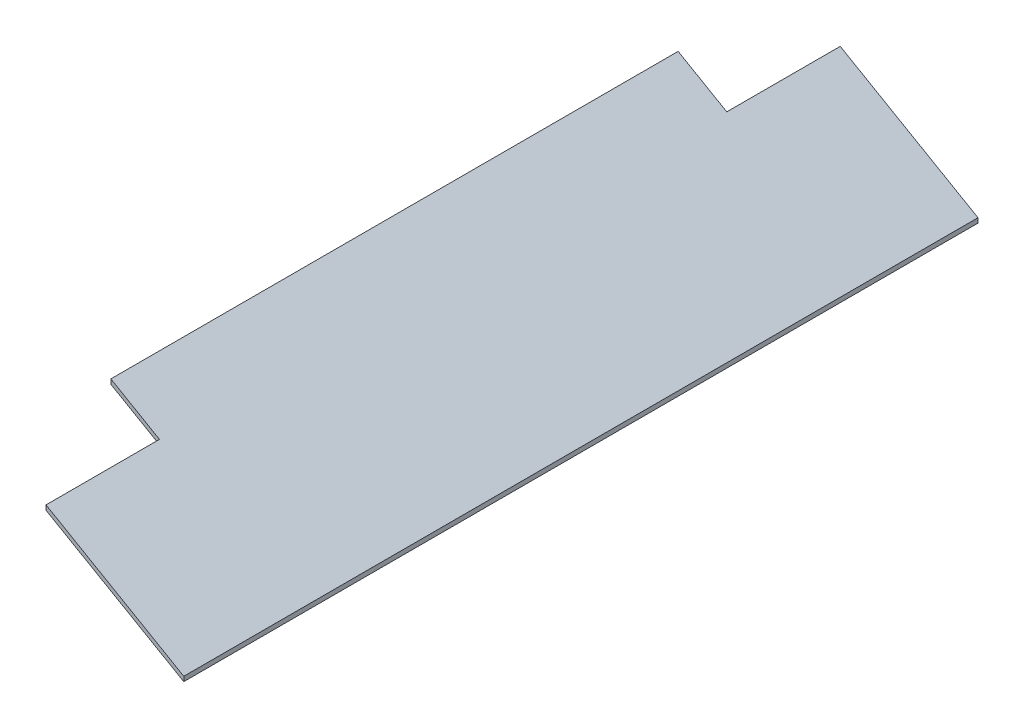
ISO-10303-21;
HEADER;
FILE_DESCRIPTION(('STEP AP214'),'2;1');
FILE_NAME('part.step','',(''),(''),'','','');
FILE_SCHEMA(('AUTOMOTIVE_DESIGN { 1 0 10303 214 1 1 1 1 }'));
ENDSEC;
DATA;
#1=APPLICATION_CONTEXT('core data for automotive mechanical design processes');
#2=APPLICATION_PROTOCOL_DEFINITION('international standard','automotive_design',2000,#1);
#3=PRODUCT_CONTEXT('',#1,'mechanical');
#4=PRODUCT('Part','Part','',(#3));
#5=PRODUCT_RELATED_PRODUCT_CATEGORY('part','',(#4));
#6=PRODUCT_DEFINITION_FORMATION('','',#4);
#7=PRODUCT_DEFINITION_CONTEXT('part definition',#1,'design');
#8=PRODUCT_DEFINITION('design','',#6,#7);
#9=PRODUCT_DEFINITION_SHAPE('','',#8);
#10=(LENGTH_UNIT() NAMED_UNIT(*) SI_UNIT(.MILLI.,.METRE.));
#11=(NAMED_UNIT(*) PLANE_ANGLE_UNIT() SI_UNIT($,.RADIAN.));
#12=(NAMED_UNIT(*) SI_UNIT($,.STERADIAN.) SOLID_ANGLE_UNIT());
#13=UNCERTAINTY_MEASURE_WITH_UNIT(LENGTH_MEASURE(1.E-05),#10,'distance_accuracy_value','');
#14=(GEOMETRIC_REPRESENTATION_CONTEXT(3) GLOBAL_UNCERTAINTY_ASSIGNED_CONTEXT((#13)) GLOBAL_UNIT_ASSIGNED_CONTEXT((#10,
#11,#12)) REPRESENTATION_CONTEXT('',''));
#15=CARTESIAN_POINT('',(0.,0.,0.));
#16=DIRECTION('',(0.,0.,1.));
#17=DIRECTION('',(1.,0.,0.));
#18=AXIS2_PLACEMENT_3D('',#15,#16,#17);
#19=CARTESIAN_POINT('',(-146.05,84.3220068151443,311.15));
#20=DIRECTION('',(-0.499999999999998,-0.86602540378444,0.));
#21=DIRECTION('',(0.86602540378444,-0.499999999999998,0.));
#22=AXIS2_PLACEMENT_3D('',#19,#20,#21);
#23=PLANE('',#22);
#24=DIRECTION('',(0.,0.,-1.));
#25=VECTOR('',#24,1.);
#26=CARTESIAN_POINT('',(-107.95,62.3249615590197,311.15));
#27=LINE('',#26,#25);
#28=CARTESIAN_POINT('',(-107.95,62.3249615590197,311.15));
#29=VERTEX_POINT('',#28);
#30=CARTESIAN_POINT('',(-107.95,62.3249615590197,222.25));
#31=VERTEX_POINT('',#30);
#32=EDGE_CURVE('E144',#29,#31,#27,.T.);
#33=ORIENTED_EDGE('',*,*,#32,.F.);
#34=DIRECTION('',(-0.86602540378444,0.499999999999998,0.));
#35=VECTOR('',#34,1.);
#36=CARTESIAN_POINT('',(-146.05,84.3220068151443,311.15));
#37=LINE('',#36,#35);
#38=CARTESIAN_POINT('',(0.,0.,311.15));
#39=VERTEX_POINT('',#38);
#40=EDGE_CURVE('E154',#39,#29,#37,.T.);
#41=ORIENTED_EDGE('',*,*,#40,.F.);
#42=DIRECTION('',(0.,0.,-1.));
#43=VECTOR('',#42,1.);
#44=CARTESIAN_POINT('',(0.,0.,311.15));
#45=LINE('',#44,#43);
#46=CARTESIAN_POINT('',(0.,0.,-311.15));
#47=VERTEX_POINT('',#46);
#48=EDGE_CURVE('E162',#39,#47,#45,.T.);
#49=ORIENTED_EDGE('',*,*,#48,.T.);
#50=DIRECTION('',(-0.86602540378444,0.499999999999998,0.));
#51=VECTOR('',#50,1.);
#52=CARTESIAN_POINT('',(-146.05,84.3220068151443,-311.15));
#53=LINE('',#52,#51);
#54=CARTESIAN_POINT('',(-107.95,62.3249615590197,-311.15));
#55=VERTEX_POINT('',#54);
#56=EDGE_CURVE('E111',#47,#55,#53,.T.);
#57=ORIENTED_EDGE('',*,*,#56,.T.);
#58=DIRECTION('',(0.,0.,-1.));
#59=VECTOR('',#58,1.);
#60=CARTESIAN_POINT('',(-107.95,62.3249615590196,311.15));
#61=LINE('',#60,#59);
#62=CARTESIAN_POINT('',(-107.95,62.3249615590197,-222.25));
#63=VERTEX_POINT('',#62);
#64=EDGE_CURVE('E59',#63,#55,#61,.T.);
#65=ORIENTED_EDGE('',*,*,#64,.F.);
#66=DIRECTION('',(0.86602540378444,-0.499999999999998,0.));
#67=VECTOR('',#66,1.);
#68=CARTESIAN_POINT('',(-146.05,84.3220068151443,-222.25));
#69=LINE('',#68,#67);
#70=CARTESIAN_POINT('',(-146.05,84.3220068151443,-222.25));
#71=VERTEX_POINT('',#70);
#72=EDGE_CURVE('E112',#71,#63,#69,.T.);
#73=ORIENTED_EDGE('',*,*,#72,.F.);
#74=DIRECTION('',(0.,0.,-1.));
#75=VECTOR('',#74,1.);
#76=CARTESIAN_POINT('',(-146.05,84.3220068151443,311.15));
#77=LINE('',#76,#75);
#78=CARTESIAN_POINT('',(-146.05,84.3220068151443,222.25));
#79=VERTEX_POINT('',#78);
#80=EDGE_CURVE('E119',#79,#71,#77,.T.);
#81=ORIENTED_EDGE('',*,*,#80,.F.);
#82=DIRECTION('',(-0.86602540378444,0.499999999999998,0.));
#83=VECTOR('',#82,1.);
#84=CARTESIAN_POINT('',(-146.05,84.3220068151443,222.25));
#85=LINE('',#84,#83);
#86=EDGE_CURVE('E102',#31,#79,#85,.T.);
#87=ORIENTED_EDGE('',*,*,#86,.F.);
#88=EDGE_LOOP('',(#33,#41,#49,#57,#65,#73,#81,#87));
#89=FACE_BOUND('',#88,.T.);
#90=ADVANCED_FACE('F37',(#89),#23,.F.);
#91=CARTESIAN_POINT('',(-146.05,80.6558326057902,311.15));
#92=DIRECTION('',(1.,0.,0.));
#93=DIRECTION('',(0.,0.,-1.));
#94=AXIS2_PLACEMENT_3D('',#91,#92,#93);
#95=PLANE('',#94);
#96=DIRECTION('',(0.,-1.,0.));
#97=VECTOR('',#96,1.);
#98=CARTESIAN_POINT('',(-146.05,84.3220068151443,222.25));
#99=LINE('',#98,#97);
#100=CARTESIAN_POINT('',(-146.05,80.6558326057902,222.25));
#101=VERTEX_POINT('',#100);
#102=EDGE_CURVE('E105',#79,#101,#99,.T.);
#103=ORIENTED_EDGE('',*,*,#102,.F.);
#104=ORIENTED_EDGE('',*,*,#80,.T.);
#105=DIRECTION('',(0.,-1.,0.));
#106=VECTOR('',#105,1.);
#107=CARTESIAN_POINT('',(-146.05,84.3220068151443,-222.25));
#108=LINE('',#107,#106);
#109=CARTESIAN_POINT('',(-146.05,80.6558326057902,-222.25));
#110=VERTEX_POINT('',#109);
#111=EDGE_CURVE('E137',#71,#110,#108,.T.);
#112=ORIENTED_EDGE('',*,*,#111,.T.);
#113=DIRECTION('',(0.,0.,-1.));
#114=VECTOR('',#113,1.);
#115=CARTESIAN_POINT('',(-146.05,80.6558326057902,311.15));
#116=LINE('',#115,#114);
#117=EDGE_CURVE('E121',#101,#110,#116,.T.);
#118=ORIENTED_EDGE('',*,*,#117,.F.);
#119=EDGE_LOOP('',(#103,#104,#112,#118));
#120=FACE_BOUND('',#119,.T.);
#121=ADVANCED_FACE('F117',(#120),#95,.F.);
#122=CARTESIAN_POINT('',(0.,-3.66617420935411,311.15));
#123=DIRECTION('',(0.499999999999998,0.86602540378444,0.));
#124=DIRECTION('',(-0.86602540378444,0.499999999999998,0.));
#125=AXIS2_PLACEMENT_3D('',#122,#123,#124);
#126=PLANE('',#125);
#127=DIRECTION('',(0.,0.,1.));
#128=VECTOR('',#127,1.);
#129=CARTESIAN_POINT('',(-107.95,58.6587873496656,311.15));
#130=LINE('',#129,#128);
#131=CARTESIAN_POINT('',(-107.95,58.6587873496656,222.25));
#132=VERTEX_POINT('',#131);
#133=CARTESIAN_POINT('',(-107.95,58.6587873496656,311.15));
#134=VERTEX_POINT('',#133);
#135=EDGE_CURVE('E51',#132,#134,#130,.T.);
#136=ORIENTED_EDGE('',*,*,#135,.F.);
#137=DIRECTION('',(0.86602540378444,-0.499999999999998,0.));
#138=VECTOR('',#137,1.);
#139=CARTESIAN_POINT('',(0.,-3.66617420935411,222.25));
#140=LINE('',#139,#138);
#141=EDGE_CURVE('E11',#101,#132,#140,.T.);
#142=ORIENTED_EDGE('',*,*,#141,.F.);
#143=ORIENTED_EDGE('',*,*,#117,.T.);
#144=DIRECTION('',(-0.86602540378444,0.499999999999998,0.));
#145=VECTOR('',#144,1.);
#146=CARTESIAN_POINT('',(0.,-3.66617420935411,-222.25));
#147=LINE('',#146,#145);
#148=CARTESIAN_POINT('',(-107.95,58.6587873496656,-222.25));
#149=VERTEX_POINT('',#148);
#150=EDGE_CURVE('E44',#149,#110,#147,.T.);
#151=ORIENTED_EDGE('',*,*,#150,.F.);
#152=DIRECTION('',(0.,0.,1.));
#153=VECTOR('',#152,1.);
#154=CARTESIAN_POINT('',(-107.95,58.6587873496655,311.15));
#155=LINE('',#154,#153);
#156=CARTESIAN_POINT('',(-107.95,58.6587873496656,-311.15));
#157=VERTEX_POINT('',#156);
#158=EDGE_CURVE('E145',#157,#149,#155,.T.);
#159=ORIENTED_EDGE('',*,*,#158,.F.);
#160=DIRECTION('',(0.86602540378444,-0.499999999999998,0.));
#161=VECTOR('',#160,1.);
#162=CARTESIAN_POINT('',(0.,-3.66617420935411,-311.15));
#163=LINE('',#162,#161);
#164=CARTESIAN_POINT('',(0.,-3.66617420935411,-311.15));
#165=VERTEX_POINT('',#164);
#166=EDGE_CURVE('E165',#157,#165,#163,.T.);
#167=ORIENTED_EDGE('',*,*,#166,.T.);
#168=DIRECTION('',(0.,0.,-1.));
#169=VECTOR('',#168,1.);
#170=CARTESIAN_POINT('',(0.,-3.66617420935411,311.15));
#171=LINE('',#170,#169);
#172=CARTESIAN_POINT('',(0.,-3.66617420935411,311.15));
#173=VERTEX_POINT('',#172);
#174=EDGE_CURVE('E129',#173,#165,#171,.T.);
#175=ORIENTED_EDGE('',*,*,#174,.F.);
#176=DIRECTION('',(0.86602540378444,-0.499999999999998,0.));
#177=VECTOR('',#176,1.);
#178=CARTESIAN_POINT('',(0.,-3.66617420935411,311.15));
#179=LINE('',#178,#177);
#180=EDGE_CURVE('E157',#134,#173,#179,.T.);
#181=ORIENTED_EDGE('',*,*,#180,.F.);
#182=EDGE_LOOP('',(#136,#142,#143,#151,#159,#167,#175,#181));
#183=FACE_BOUND('',#182,.T.);
#184=ADVANCED_FACE('F141',(#183),#126,.F.);
#185=CARTESIAN_POINT('',(0.,0.,311.15));
#186=DIRECTION('',(0.,0.,-1.));
#187=DIRECTION('',(-1.,0.,0.));
#188=AXIS2_PLACEMENT_3D('',#185,#186,#187);
#189=PLANE('',#188);
#190=DIRECTION('',(0.,1.,0.));
#191=VECTOR('',#190,1.);
#192=CARTESIAN_POINT('',(-107.95,0.,311.15));
#193=LINE('',#192,#191);
#194=EDGE_CURVE('E127',#134,#29,#193,.T.);
#195=ORIENTED_EDGE('',*,*,#194,.F.);
#196=ORIENTED_EDGE('',*,*,#180,.T.);
#197=DIRECTION('',(0.,1.,0.));
#198=VECTOR('',#197,1.);
#199=CARTESIAN_POINT('',(0.,0.,311.15));
#200=LINE('',#199,#198);
#201=EDGE_CURVE('E160',#173,#39,#200,.T.);
#202=ORIENTED_EDGE('',*,*,#201,.T.);
#203=ORIENTED_EDGE('',*,*,#40,.T.);
#204=EDGE_LOOP('',(#195,#196,#202,#203));
#205=FACE_BOUND('',#204,.T.);
#206=ADVANCED_FACE('F182',(#205),#189,.F.);
#207=CARTESIAN_POINT('',(0.,0.,-311.15));
#208=DIRECTION('',(0.,0.,-1.));
#209=DIRECTION('',(-1.,0.,0.));
#210=AXIS2_PLACEMENT_3D('',#207,#208,#209);
#211=PLANE('',#210);
#212=ORIENTED_EDGE('',*,*,#166,.F.);
#213=DIRECTION('',(0.,1.,0.));
#214=VECTOR('',#213,1.);
#215=CARTESIAN_POINT('',(-107.95,0.,-311.15));
#216=LINE('',#215,#214);
#217=EDGE_CURVE('E125',#157,#55,#216,.T.);
#218=ORIENTED_EDGE('',*,*,#217,.T.);
#219=ORIENTED_EDGE('',*,*,#56,.F.);
#220=DIRECTION('',(0.,1.,0.));
#221=VECTOR('',#220,1.);
#222=CARTESIAN_POINT('',(0.,0.,-311.15));
#223=LINE('',#222,#221);
#224=EDGE_CURVE('E158',#165,#47,#223,.T.);
#225=ORIENTED_EDGE('',*,*,#224,.F.);
#226=EDGE_LOOP('',(#212,#218,#219,#225));
#227=FACE_BOUND('',#226,.T.);
#228=ADVANCED_FACE('F179',(#227),#211,.T.);
#229=CARTESIAN_POINT('',(0.,0.,311.15));
#230=DIRECTION('',(-1.,0.,0.));
#231=DIRECTION('',(0.,-1.,0.));
#232=AXIS2_PLACEMENT_3D('',#229,#230,#231);
#233=PLANE('',#232);
#234=ORIENTED_EDGE('',*,*,#224,.T.);
#235=ORIENTED_EDGE('',*,*,#48,.F.);
#236=ORIENTED_EDGE('',*,*,#201,.F.);
#237=ORIENTED_EDGE('',*,*,#174,.T.);
#238=EDGE_LOOP('',(#234,#235,#236,#237));
#239=FACE_BOUND('',#238,.T.);
#240=ADVANCED_FACE('F174',(#239),#233,.F.);
#241=CARTESIAN_POINT('',(-146.05,84.3220068151443,-222.25));
#242=DIRECTION('',(0.,0.,-1.));
#243=DIRECTION('',(-1.,0.,0.));
#244=AXIS2_PLACEMENT_3D('',#241,#242,#243);
#245=PLANE('',#244);
#246=ORIENTED_EDGE('',*,*,#72,.T.);
#247=DIRECTION('',(0.,-1.,0.));
#248=VECTOR('',#247,1.);
#249=CARTESIAN_POINT('',(-107.95,84.3220068151443,-222.25));
#250=LINE('',#249,#248);
#251=EDGE_CURVE('E122',#63,#149,#250,.T.);
#252=ORIENTED_EDGE('',*,*,#251,.T.);
#253=ORIENTED_EDGE('',*,*,#150,.T.);
#254=ORIENTED_EDGE('',*,*,#111,.F.);
#255=EDGE_LOOP('',(#246,#252,#253,#254));
#256=FACE_BOUND('',#255,.T.);
#257=ADVANCED_FACE('F136',(#256),#245,.T.);
#258=CARTESIAN_POINT('',(-107.95,84.3220068151443,-311.15));
#259=DIRECTION('',(-1.,0.,0.));
#260=DIRECTION('',(0.,0.,1.));
#261=AXIS2_PLACEMENT_3D('',#258,#259,#260);
#262=PLANE('',#261);
#263=ORIENTED_EDGE('',*,*,#64,.T.);
#264=ORIENTED_EDGE('',*,*,#217,.F.);
#265=ORIENTED_EDGE('',*,*,#158,.T.);
#266=ORIENTED_EDGE('',*,*,#251,.F.);
#267=EDGE_LOOP('',(#263,#264,#265,#266));
#268=FACE_BOUND('',#267,.T.);
#269=ADVANCED_FACE('F203',(#268),#262,.T.);
#270=CARTESIAN_POINT('',(-146.05,84.3220068151443,222.25));
#271=DIRECTION('',(0.,0.,1.));
#272=DIRECTION('',(1.,0.,0.));
#273=AXIS2_PLACEMENT_3D('',#270,#271,#272);
#274=PLANE('',#273);
#275=ORIENTED_EDGE('',*,*,#86,.T.);
#276=ORIENTED_EDGE('',*,*,#102,.T.);
#277=ORIENTED_EDGE('',*,*,#141,.T.);
#278=DIRECTION('',(0.,-1.,0.));
#279=VECTOR('',#278,1.);
#280=CARTESIAN_POINT('',(-107.95,84.3220068151443,222.25));
#281=LINE('',#280,#279);
#282=EDGE_CURVE('E107',#31,#132,#281,.T.);
#283=ORIENTED_EDGE('',*,*,#282,.F.);
#284=EDGE_LOOP('',(#275,#276,#277,#283));
#285=FACE_BOUND('',#284,.T.);
#286=ADVANCED_FACE('F104',(#285),#274,.T.);
#287=CARTESIAN_POINT('',(-107.95,84.3220068151443,311.15));
#288=DIRECTION('',(-1.,0.,0.));
#289=DIRECTION('',(0.,0.,1.));
#290=AXIS2_PLACEMENT_3D('',#287,#288,#289);
#291=PLANE('',#290);
#292=ORIENTED_EDGE('',*,*,#32,.T.);
#293=ORIENTED_EDGE('',*,*,#282,.T.);
#294=ORIENTED_EDGE('',*,*,#135,.T.);
#295=ORIENTED_EDGE('',*,*,#194,.T.);
#296=EDGE_LOOP('',(#292,#293,#294,#295));
#297=FACE_BOUND('',#296,.T.);
#298=ADVANCED_FACE('F143',(#297),#291,.T.);
#299=CLOSED_SHELL('',(#90,#121,#184,#206,#228,#240,#257,#269,#286,#298));
#300=MANIFOLD_SOLID_BREP('B2',#299);
#301=ADVANCED_BREP_SHAPE_REPRESENTATION('',(#18,#300),#14);
#302=SHAPE_DEFINITION_REPRESENTATION(#9,#301);
ENDSEC;
END-ISO-10303-21;
